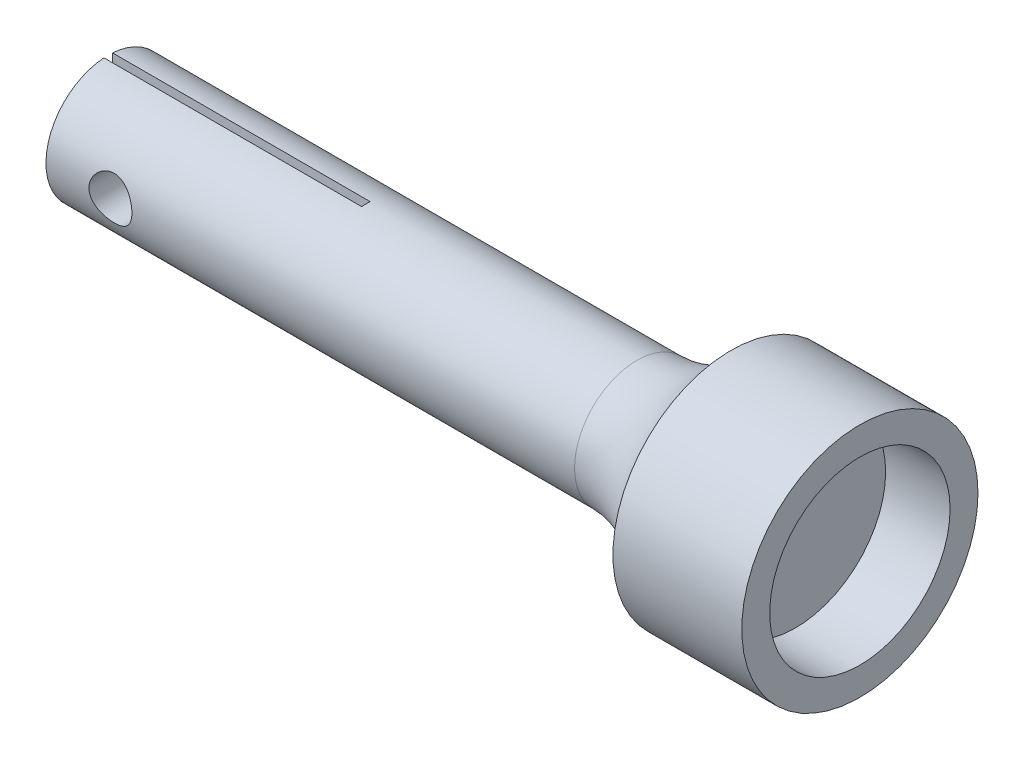
ISO-10303-21;
HEADER;
FILE_DESCRIPTION(('STEP AP214'),'2;1');
FILE_NAME('part.step','',(''),(''),'','','');
FILE_SCHEMA(('AUTOMOTIVE_DESIGN { 1 0 10303 214 1 1 1 1 }'));
ENDSEC;
DATA;
#1=APPLICATION_CONTEXT('core data for automotive mechanical design processes');
#2=APPLICATION_PROTOCOL_DEFINITION('international standard','automotive_design',2000,#1);
#3=PRODUCT_CONTEXT('',#1,'mechanical');
#4=PRODUCT('Part','Part','',(#3));
#5=PRODUCT_RELATED_PRODUCT_CATEGORY('part','',(#4));
#6=PRODUCT_DEFINITION_FORMATION('','',#4);
#7=PRODUCT_DEFINITION_CONTEXT('part definition',#1,'design');
#8=PRODUCT_DEFINITION('design','',#6,#7);
#9=PRODUCT_DEFINITION_SHAPE('','',#8);
#10=(LENGTH_UNIT() NAMED_UNIT(*) SI_UNIT(.MILLI.,.METRE.));
#11=(NAMED_UNIT(*) PLANE_ANGLE_UNIT() SI_UNIT($,.RADIAN.));
#12=(NAMED_UNIT(*) SI_UNIT($,.STERADIAN.) SOLID_ANGLE_UNIT());
#13=UNCERTAINTY_MEASURE_WITH_UNIT(LENGTH_MEASURE(1.E-05),#10,'distance_accuracy_value','');
#14=(GEOMETRIC_REPRESENTATION_CONTEXT(3) GLOBAL_UNCERTAINTY_ASSIGNED_CONTEXT((#13)) GLOBAL_UNIT_ASSIGNED_CONTEXT((#10,
#11,#12)) REPRESENTATION_CONTEXT('',''));
#15=CARTESIAN_POINT('',(0.,0.,0.));
#16=DIRECTION('',(0.,0.,1.));
#17=DIRECTION('',(1.,0.,0.));
#18=AXIS2_PLACEMENT_3D('',#15,#16,#17);
#19=CARTESIAN_POINT('',(35.,0.,0.));
#20=DIRECTION('',(-1.,0.,0.));
#21=DIRECTION('',(0.,0.,1.));
#22=AXIS2_PLACEMENT_3D('',#19,#20,#21);
#23=CYLINDRICAL_SURFACE('',#22,2.9);
#24=CARTESIAN_POINT('',(24.6136575601077,0.,0.));
#25=DIRECTION('',(1.,0.,0.));
#26=DIRECTION('',(0.,0.,-1.));
#27=AXIS2_PLACEMENT_3D('',#24,#25,#26);
#28=CIRCLE('',#27,2.9);
#29=CARTESIAN_POINT('',(24.6136575601077,0.,-2.9));
#30=VERTEX_POINT('',#29);
#31=EDGE_CURVE('E11',#30,#30,#28,.F.);
#32=ORIENTED_EDGE('',*,*,#31,.T.);
#33=EDGE_LOOP('',(#32));
#34=FACE_BOUND('',#33,.T.);
#35=CARTESIAN_POINT('',(3.99999404049821,0.,2.9));
#36=CARTESIAN_POINT('',(3.99980665343065,0.054464581520682,2.90000044547209));
#37=CARTESIAN_POINT('',(3.99515402737745,0.108909158166563,2.89845171840446));
#38=CARTESIAN_POINT('',(3.97710229156492,0.216157473174874,2.89243177943249));
#39=CARTESIAN_POINT('',(3.9637028451294,0.268961148294962,2.88796045503368));
#40=CARTESIAN_POINT('',(3.92867385100979,0.371366993483788,2.87658461533888));
#41=CARTESIAN_POINT('',(3.90705867249376,0.420974577301274,2.86968434976551));
#42=CARTESIAN_POINT('',(3.8562767609551,0.515862220429733,2.85415499250082));
#43=CARTESIAN_POINT('',(3.82710838351144,0.56114133443872,2.84552552443424));
#44=CARTESIAN_POINT('',(3.76092262611943,0.647750205160698,2.82709145927908));
#45=CARTESIAN_POINT('',(3.72367717078349,0.688899359123849,2.81725739643333));
#46=CARTESIAN_POINT('',(3.6428854967667,0.764506273208073,2.79768802354975));
#47=CARTESIAN_POINT('',(3.59933778581236,0.798962443999024,2.78795273748656));
#48=CARTESIAN_POINT('',(3.50554398533497,0.861237782008968,2.76936103341232));
#49=CARTESIAN_POINT('',(3.45513351226858,0.888821182355332,2.76054069383681));
#50=CARTESIAN_POINT('',(3.3500356479676,0.935039630398493,2.74523188932798));
#51=CARTESIAN_POINT('',(3.2953496859037,0.953677653526569,2.73874264920008));
#52=CARTESIAN_POINT('',(3.18532355782714,0.980797899806465,2.72914583302455));
#53=CARTESIAN_POINT('',(3.13007764885033,0.989621255546706,2.72592503337929));
#54=CARTESIAN_POINT('',(3.01880301099517,0.997924912373514,2.72289687865501));
#55=CARTESIAN_POINT('',(2.96277454438534,0.997408272016872,2.72308840614522));
#56=CARTESIAN_POINT('',(2.85441917057035,0.987316689406509,2.72676179672425));
#57=CARTESIAN_POINT('',(2.80204475248956,0.978183450876782,2.73008320631409));
#58=CARTESIAN_POINT('',(2.69962143511588,0.951832893957071,2.73938083645186));
#59=CARTESIAN_POINT('',(2.64957283929843,0.93461452384829,2.74535740237868));
#60=CARTESIAN_POINT('',(2.55219599498333,0.892282191854265,2.75940857278499));
#61=CARTESIAN_POINT('',(2.50493107985492,0.867034678862537,2.76751823130884));
#62=CARTESIAN_POINT('',(2.41516871979746,0.80945460858557,2.78490319254488));
#63=CARTESIAN_POINT('',(2.37267273223009,0.777119894351839,2.79417884975467));
#64=CARTESIAN_POINT('',(2.29116909991086,0.704158799925793,2.8134781728678));
#65=CARTESIAN_POINT('',(2.25248726077434,0.663171085198727,2.8235147369521));
#66=CARTESIAN_POINT('',(2.18246122272713,0.575160566726664,2.8427481160544));
#67=CARTESIAN_POINT('',(2.15111776786691,0.528137151760101,2.85194484586265));
#68=CARTESIAN_POINT('',(2.09640712786078,0.428717022858946,2.86858225182407));
#69=CARTESIAN_POINT('',(2.07312425104658,0.376270552797056,2.87600412946802));
#70=CARTESIAN_POINT('',(2.03581341715102,0.267887851730581,2.88811418602225));
#71=CARTESIAN_POINT('',(2.02178199451763,0.211952936085917,2.8928033885035));
#72=CARTESIAN_POINT('',(2.00395289725498,0.100961462789691,2.89875006472955));
#73=CARTESIAN_POINT('',(1.99971179013511,0.0459839946263828,2.9001562709705));
#74=CARTESIAN_POINT('',(2.00031855062634,-0.0639052332866241,2.89981604187808));
#75=CARTESIAN_POINT('',(2.0051648190918,-0.11881700289607,2.89807016123339));
#76=CARTESIAN_POINT('',(2.02346217628331,-0.225268981602774,2.89171457884867));
#77=CARTESIAN_POINT('',(2.03664609239861,-0.276860942125065,2.88719392029373));
#78=CARTESIAN_POINT('',(2.07090854913095,-0.377075950510623,2.87582321844246));
#79=CARTESIAN_POINT('',(2.09198813894617,-0.425698602805168,2.86897286558128));
#80=CARTESIAN_POINT('',(2.14210048983227,-0.520120040805734,2.85338931812693));
#81=CARTESIAN_POINT('',(2.1713404581055,-0.565800780840766,2.84460854341361));
#82=CARTESIAN_POINT('',(2.23669836559923,-0.651748288075913,2.82615633153855));
#83=CARTESIAN_POINT('',(2.27281854838725,-0.692013281929063,2.81648460437907));
#84=CARTESIAN_POINT('',(2.35299098168643,-0.768028568002401,2.79673919728646));
#85=CARTESIAN_POINT('',(2.39734388624321,-0.803463444220474,2.78666888404577));
#86=CARTESIAN_POINT('',(2.49158732273754,-0.866428441564636,2.7677402735469));
#87=CARTESIAN_POINT('',(2.54147794779419,-0.893958429738781,2.75888199667523));
#88=CARTESIAN_POINT('',(2.64543181696445,-0.940207758493911,2.7434660823836));
#89=CARTESIAN_POINT('',(2.69948770095462,-0.958942243405089,2.73690449545739));
#90=CARTESIAN_POINT('',(2.81026916189554,-0.986947229101579,2.72693244905969));
#91=CARTESIAN_POINT('',(2.86699339762616,-0.996222432433082,2.72352042390887));
#92=CARTESIAN_POINT('',(2.97811491365893,-1.0046779545737,2.72041177966843));
#93=CARTESIAN_POINT('',(3.03246675490548,-1.00438965020841,2.72051958296488));
#94=CARTESIAN_POINT('',(3.14030165471986,-0.995038917259361,2.72395333951936));
#95=CARTESIAN_POINT('',(3.19378476731157,-0.985977036420873,2.72727909187684));
#96=CARTESIAN_POINT('',(3.29723879287659,-0.95971526277338,2.73662809198885));
#97=CARTESIAN_POINT('',(3.34725998961496,-0.942691032115901,2.7425929700232));
#98=CARTESIAN_POINT('',(3.44377502275892,-0.901130615751718,2.75652711698348));
#99=CARTESIAN_POINT('',(3.49026803090592,-0.876592672931814,2.7644968546764));
#100=CARTESIAN_POINT('',(3.5807694389694,-0.81936057432578,2.78201053480927));
#101=CARTESIAN_POINT('',(3.62455916653442,-0.786337970636084,2.79161076236934));
#102=CARTESIAN_POINT('',(3.70614544398798,-0.713625822124459,2.81107686227833));
#103=CARTESIAN_POINT('',(3.74394023447129,-0.673934327115972,2.82094281162167));
#104=CARTESIAN_POINT('',(3.81409384195148,-0.58697807802039,2.84033823368347));
#105=CARTESIAN_POINT('',(3.84615168018305,-0.539462338137375,2.84983535691801));
#106=CARTESIAN_POINT('',(3.9017928586473,-0.439394021766622,2.86696796562436));
#107=CARTESIAN_POINT('',(3.92537770645062,-0.386842343416355,2.8746037821944));
#108=CARTESIAN_POINT('',(3.96282035416129,-0.279387678342414,2.8870052949059));
#109=CARTESIAN_POINT('',(3.97688430549397,-0.224563783257893,2.89183147940451));
#110=CARTESIAN_POINT('',(3.99556692245,-0.113152346944582,2.89832808821211));
#111=CARTESIAN_POINT('',(4.00018865544312,-0.0565653845270848,2.8999995373452));
#112=CARTESIAN_POINT('',(3.99999404049821,0.,2.9));
#113=B_SPLINE_CURVE_WITH_KNOTS('',3,(#35,#36,#37,#38,#39,#40,#41,#42,#43,#44,#45,#46,#47,#48,
#49,#50,#51,#52,#53,#54,#55,#56,#57,#58,#59,#60,#61,#62,#63,#64,#65,#66,#67,#68,#69,#70,#71,#72,
#73,#74,#75,#76,#77,#78,#79,#80,#81,#82,#83,#84,#85,#86,#87,#88,#89,#90,#91,#92,#93,#94,#95,#96,
#97,#98,#99,#100,#101,#102,#103,#104,#105,#106,#107,#108,#109,#110,#111,#112),.UNSPECIFIED.,.T.,
.F.,(4,2,2,2,2,2,2,2,2,2,2,2,2,2,2,2,2,2,2,2,2,2,2,2,2,2,2,2,2,2,2,2,2,2,2,2,2,2,4),(0.,
0.163186329623232,0.326378940865444,0.489287434816881,0.652231425742869,0.820575212375441,
0.988958925545892,1.16250309549465,1.33598950072153,1.50323671978019,1.67042917159445,
1.82949148194305,1.98857448894733,2.15045566021257,2.31238616765092,2.48332953743942,
2.65429023195019,2.82698856165705,2.99962216255688,3.16426883704888,3.32888654065694,
3.48847938434288,3.64809344267939,3.812201329649,3.97636282241749,4.14852002962218,
4.32068013216137,4.49254270776625,4.66431980264653,4.82656931927434,4.98880870711639,
5.14762644984913,5.30648136118026,5.47278373043322,5.63913481646781,5.81258816901448,
5.98601064428797,6.15554646618413,6.32502720443595),.UNSPECIFIED.);
#114=CARTESIAN_POINT('',(3.99999404049821,0.,2.9));
#115=VERTEX_POINT('',#114);
#116=EDGE_CURVE('E98',#115,#115,#113,.T.);
#117=ORIENTED_EDGE('',*,*,#116,.F.);
#118=EDGE_LOOP('',(#117));
#119=FACE_BOUND('',#118,.T.);
#120=CARTESIAN_POINT('',(3.,-1.00345238585106,-2.72086076625207));
#121=CARTESIAN_POINT('',(2.94566893235899,-1.00345305999284,-2.72086021317153));
#122=CARTESIAN_POINT('',(2.89134253045788,-0.999009639562248,-2.72251153528407));
#123=CARTESIAN_POINT('',(2.7843073470255,-0.981419137113374,-2.72890129793882));
#124=CARTESIAN_POINT('',(2.7315987427294,-0.968271105011566,-2.73364007546708));
#125=CARTESIAN_POINT('',(2.62936917680646,-0.933795402899488,-2.74560649818595));
#126=CARTESIAN_POINT('',(2.57984181812114,-0.912484788995944,-2.75282895042417));
#127=CARTESIAN_POINT('',(2.48504853913221,-0.862348136474104,-2.76894323666809));
#128=CARTESIAN_POINT('',(2.43978366537773,-0.833520258689754,-2.77783547905372));
#129=CARTESIAN_POINT('',(2.35289105098564,-0.767865567456131,-2.79671067974953));
#130=CARTESIAN_POINT('',(2.31146906378093,-0.730774639190829,-2.80672237157249));
#131=CARTESIAN_POINT('',(2.23529155720145,-0.650209936416532,-2.82647224615793));
#132=CARTESIAN_POINT('',(2.20053721085951,-0.606735041151961,-2.83621038053691));
#133=CARTESIAN_POINT('',(2.1377241490165,-0.513105991243302,-2.8546557797525));
#134=CARTESIAN_POINT('',(2.10988488496225,-0.462796598211759,-2.86332568248111));
#135=CARTESIAN_POINT('',(2.06314738996144,-0.357858093927532,-2.87832267666306));
#136=CARTESIAN_POINT('',(2.04424657693797,-0.303230235491405,-2.8846504445809));
#137=CARTESIAN_POINT('',(2.01662338042609,-0.193347112050209,-2.8940531545862));
#138=CARTESIAN_POINT('',(2.00755063122176,-0.138189654742778,-2.8972396740321));
#139=CARTESIAN_POINT('',(1.9987266279835,-0.027049048629246,-2.9004060699528));
#140=CARTESIAN_POINT('',(1.99897278546178,0.0289338665728237,-2.90038683687585));
#141=CARTESIAN_POINT('',(2.00856252393479,0.137625582023931,-2.89722155986127));
#142=CARTESIAN_POINT('',(2.01752155515124,0.190372821437223,-2.89420757026013));
#143=CARTESIAN_POINT('',(2.04364549230479,0.293565337173213,-2.88556784571808));
#144=CARTESIAN_POINT('',(2.0608109506516,0.344010458280031,-2.87994193495832));
#145=CARTESIAN_POINT('',(2.10306380374873,0.441955880220833,-2.86655764298503));
#146=CARTESIAN_POINT('',(2.12825303409353,0.489408372673726,-2.85877202516899));
#147=CARTESIAN_POINT('',(2.18575280861581,0.579523136222244,-2.84187578287272));
#148=CARTESIAN_POINT('',(2.21806541694259,0.622184013426224,-2.83276477459341));
#149=CARTESIAN_POINT('',(2.29078922512315,0.703762509714338,-2.81363851749344));
#150=CARTESIAN_POINT('',(2.33152455198626,0.742386348329868,-2.80360083413691));
#151=CARTESIAN_POINT('',(2.41897100792909,0.812355016067043,-2.7841338849641));
#152=CARTESIAN_POINT('',(2.46568319678563,0.843698551512895,-2.77470472749465));
#153=CARTESIAN_POINT('',(2.56475924012264,0.898670505204048,-2.75739707918534));
#154=CARTESIAN_POINT('',(2.61720312886419,0.922164154932908,-2.74954651501986));
#155=CARTESIAN_POINT('',(2.7256409113218,0.959884764577871,-2.73660804649032));
#156=CARTESIAN_POINT('',(2.7816331940916,0.974115897005448,-2.73151889835572));
#157=CARTESIAN_POINT('',(2.89273293123637,0.992293807321214,-2.72496651191048));
#158=CARTESIAN_POINT('',(2.94775629835506,0.996696547696071,-2.72334267843518));
#159=CARTESIAN_POINT('',(3.05776798390255,0.996391051294897,-2.72345471292078));
#160=CARTESIAN_POINT('',(3.11275630710812,0.991684614395713,-2.72518991717145));
#161=CARTESIAN_POINT('',(3.21898694835471,0.973706350635806,-2.73166254207127));
#162=CARTESIAN_POINT('',(3.27029243382318,0.96076187939061,-2.7362851027711));
#163=CARTESIAN_POINT('',(3.36998994992106,0.927073032755894,-2.7478811371546));
#164=CARTESIAN_POINT('',(3.41838144157433,0.906327219529437,-2.75485504418184));
#165=CARTESIAN_POINT('',(3.51265601203353,0.856844928483975,-2.77065167629178));
#166=CARTESIAN_POINT('',(3.55840284270796,0.827866455685994,-2.77952800547223));
#167=CARTESIAN_POINT('',(3.64454956081268,0.763010208204302,-2.79802624699304));
#168=CARTESIAN_POINT('',(3.68494776955967,0.72713027609943,-2.80764839191506));
#169=CARTESIAN_POINT('',(3.76140907639617,0.647290220975024,-2.82715171540382));
#170=CARTESIAN_POINT('',(3.79714049956896,0.603008476243458,-2.83702060425689));
#171=CARTESIAN_POINT('',(3.86069151344774,0.508832932689615,-2.85541373280247));
#172=CARTESIAN_POINT('',(3.88851133959538,0.458939300933451,-2.86393801250591));
#173=CARTESIAN_POINT('',(3.93520220991634,0.355172999359479,-2.87864166119301));
#174=CARTESIAN_POINT('',(3.95412807232818,0.301327134155515,-2.88483534639934));
#175=CARTESIAN_POINT('',(3.98257201178281,0.190960227968752,-2.89423492121065));
#176=CARTESIAN_POINT('',(3.99209373995218,0.134440234146481,-2.89744197034039));
#177=CARTESIAN_POINT('',(4.00111424155103,0.0233667148665714,-2.90041149574827));
#178=CARTESIAN_POINT('',(4.0010896475362,-0.0311441224823622,-2.90033793823468));
#179=CARTESIAN_POINT('',(3.99220909351165,-0.139345884020662,-2.89715575799774));
#180=CARTESIAN_POINT('',(3.98335391973378,-0.193036880772544,-2.89404740547828));
#181=CARTESIAN_POINT('',(3.95738342041427,-0.297127069654995,-2.88520341500109));
#182=CARTESIAN_POINT('',(3.94041665326756,-0.347567637508001,-2.87951511954888));
#183=CARTESIAN_POINT('',(3.8988467648995,-0.444900676590368,-2.86609137345669));
#184=CARTESIAN_POINT('',(3.87424222445277,-0.491792486385586,-2.8583555423899));
#185=CARTESIAN_POINT('',(3.81700012147922,-0.582681258921847,-2.84125053015508));
#186=CARTESIAN_POINT('',(3.78408808327106,-0.626495484694052,-2.83182964865602));
#187=CARTESIAN_POINT('',(3.71162253659431,-0.708132805944205,-2.81252747399333));
#188=CARTESIAN_POINT('',(3.67206682613533,-0.745953906946411,-2.80264602896683));
#189=CARTESIAN_POINT('',(3.585417997114,-0.816179871818548,-2.78302676539399));
#190=CARTESIAN_POINT('',(3.53807504193548,-0.848284273074711,-2.77331312276287));
#191=CARTESIAN_POINT('',(3.43835784877927,-0.904065659755595,-2.75563521416128));
#192=CARTESIAN_POINT('',(3.38598449552958,-0.927744123669301,-2.74767064137764));
#193=CARTESIAN_POINT('',(3.27884601645684,-0.965427356382383,-2.7346556717468));
#194=CARTESIAN_POINT('',(3.22416066899574,-0.979636796504084,-2.72954403479919));
#195=CARTESIAN_POINT('',(3.11298135708933,-0.998646999275909,-2.72264756313134));
#196=CARTESIAN_POINT('',(3.05648815675502,-1.00345168494404,-2.72086134129139));
#197=CARTESIAN_POINT('',(3.,-1.00345238585106,-2.72086076625207));
#198=B_SPLINE_CURVE_WITH_KNOTS('',3,(#120,#121,#122,#123,#124,#125,#126,#127,#128,#129,#130,
#131,#132,#133,#134,#135,#136,#137,#138,#139,#140,#141,#142,#143,#144,#145,#146,#147,#148,#149,
#150,#151,#152,#153,#154,#155,#156,#157,#158,#159,#160,#161,#162,#163,#164,#165,#166,#167,#168,
#169,#170,#171,#172,#173,#174,#175,#176,#177,#178,#179,#180,#181,#182,#183,#184,#185,#186,#187,
#188,#189,#190,#191,#192,#193,#194,#195,#196,#197),.UNSPECIFIED.,.T.,.F.,(4,2,2,2,2,2,2,2,2,2,2,
2,2,2,2,2,2,2,2,2,2,2,2,2,2,2,2,2,2,2,2,2,2,2,2,2,2,2,4),(0.,0.162783640432791,
0.325585051165192,0.48804812013714,0.650550974510754,0.819278892298359,0.98803646709062,
1.1616113480098,1.33513605716309,1.50224748559135,1.66931249626558,1.82932369651846,
1.98934566932663,2.15148543774814,2.31367225149579,2.48396770465968,2.65429339541776,
2.82740873434802,3.00044603546556,3.16527249789327,3.33006639568443,3.48868911362301,
3.64734108107733,3.81125002275815,3.97521028648539,4.14763900612138,4.32006259390509,
4.49140903416606,4.66268892350996,4.82541824017965,4.98813306951628,5.14797582779595,
5.30784830531738,5.47391952994901,5.64004590653313,5.81327030678004,5.9864642965465,
6.15578152671844,6.3250281143003),.UNSPECIFIED.);
#199=CARTESIAN_POINT('',(3.,-1.00345238585106,-2.72086076625207));
#200=VERTEX_POINT('',#199);
#201=EDGE_CURVE('E117',#200,#200,#198,.T.);
#202=ORIENTED_EDGE('',*,*,#201,.F.);
#203=EDGE_LOOP('',(#202));
#204=FACE_BOUND('',#203,.T.);
#205=CARTESIAN_POINT('',(0.,0.,0.));
#206=DIRECTION('',(1.,0.,0.));
#207=DIRECTION('',(0.,0.,-1.));
#208=AXIS2_PLACEMENT_3D('',#205,#206,#207);
#209=CIRCLE('',#208,2.9);
#210=CARTESIAN_POINT('',(0.,2.89309522829789,0.2));
#211=VERTEX_POINT('',#210);
#212=CARTESIAN_POINT('',(0.,2.89309522829789,-0.2));
#213=VERTEX_POINT('',#212);
#214=EDGE_CURVE('E106',#211,#213,#209,.T.);
#215=ORIENTED_EDGE('',*,*,#214,.T.);
#216=DIRECTION('',(-1.,0.,0.));
#217=VECTOR('',#216,1.);
#218=CARTESIAN_POINT('',(35.,2.89309522829789,-0.2));
#219=LINE('',#218,#217);
#220=CARTESIAN_POINT('',(12.,2.89309522829789,-0.2));
#221=VERTEX_POINT('',#220);
#222=EDGE_CURVE('E104',#213,#221,#219,.F.);
#223=ORIENTED_EDGE('',*,*,#222,.T.);
#224=CARTESIAN_POINT('',(12.,0.,0.));
#225=DIRECTION('',(-1.,0.,0.));
#226=DIRECTION('',(0.,0.,1.));
#227=AXIS2_PLACEMENT_3D('',#224,#225,#226);
#228=CIRCLE('',#227,2.9);
#229=CARTESIAN_POINT('',(12.,2.89309522829789,0.2));
#230=VERTEX_POINT('',#229);
#231=EDGE_CURVE('E43',#230,#221,#228,.T.);
#232=ORIENTED_EDGE('',*,*,#231,.F.);
#233=DIRECTION('',(-1.,0.,0.));
#234=VECTOR('',#233,1.);
#235=CARTESIAN_POINT('',(35.,2.89309522829789,0.2));
#236=LINE('',#235,#234);
#237=EDGE_CURVE('E100',#230,#211,#236,.T.);
#238=ORIENTED_EDGE('',*,*,#237,.T.);
#239=EDGE_LOOP('',(#215,#223,#232,#238));
#240=FACE_BOUND('',#239,.T.);
#241=ADVANCED_FACE('F35',(#34,#119,#204,#240),#23,.T.);
#242=CARTESIAN_POINT('',(0.,0.,0.));
#243=DIRECTION('',(1.,0.,0.));
#244=DIRECTION('',(0.,0.,-1.));
#245=AXIS2_PLACEMENT_3D('',#242,#243,#244);
#246=PLANE('',#245);
#247=DIRECTION('',(0.,0.,1.));
#248=VECTOR('',#247,1.);
#249=CARTESIAN_POINT('',(0.,-2.32901081224555,-0.199999999999999));
#250=LINE('',#249,#248);
#251=CARTESIAN_POINT('',(0.,-2.32901081224555,-0.199999999999999));
#252=VERTEX_POINT('',#251);
#253=CARTESIAN_POINT('',(0.,-2.32901081224555,0.200000000000001));
#254=VERTEX_POINT('',#253);
#255=EDGE_CURVE('E96',#252,#254,#250,.T.);
#256=ORIENTED_EDGE('',*,*,#255,.F.);
#257=DIRECTION('',(0.,1.,0.));
#258=VECTOR('',#257,1.);
#259=CARTESIAN_POINT('',(0.,0.,-0.2));
#260=LINE('',#259,#258);
#261=EDGE_CURVE('E85',#252,#213,#260,.T.);
#262=ORIENTED_EDGE('',*,*,#261,.T.);
#263=ORIENTED_EDGE('',*,*,#214,.F.);
#264=DIRECTION('',(0.,1.,0.));
#265=VECTOR('',#264,1.);
#266=CARTESIAN_POINT('',(0.,3.12152143585721,0.2));
#267=LINE('',#266,#265);
#268=EDGE_CURVE('E81',#254,#211,#267,.T.);
#269=ORIENTED_EDGE('',*,*,#268,.F.);
#270=EDGE_LOOP('',(#256,#262,#263,#269));
#271=FACE_BOUND('',#270,.T.);
#272=ADVANCED_FACE('F152',(#271),#246,.F.);
#273=CARTESIAN_POINT('',(12.,0.,0.));
#274=DIRECTION('',(-1.,0.,0.));
#275=DIRECTION('',(0.,0.,1.));
#276=AXIS2_PLACEMENT_3D('',#273,#274,#275);
#277=PLANE('',#276);
#278=ORIENTED_EDGE('',*,*,#231,.T.);
#279=DIRECTION('',(0.,-1.,0.));
#280=VECTOR('',#279,1.);
#281=CARTESIAN_POINT('',(12.,3.12152143585721,-0.2));
#282=LINE('',#281,#280);
#283=CARTESIAN_POINT('',(12.,-2.32901081224555,-0.199999999999999));
#284=VERTEX_POINT('',#283);
#285=EDGE_CURVE('E76',#221,#284,#282,.T.);
#286=ORIENTED_EDGE('',*,*,#285,.T.);
#287=DIRECTION('',(0.,0.,1.));
#288=VECTOR('',#287,1.);
#289=CARTESIAN_POINT('',(12.,-2.32901081224555,-0.199999999999999));
#290=LINE('',#289,#288);
#291=CARTESIAN_POINT('',(12.,-2.32901081224555,0.200000000000001));
#292=VERTEX_POINT('',#291);
#293=EDGE_CURVE('E78',#284,#292,#290,.T.);
#294=ORIENTED_EDGE('',*,*,#293,.T.);
#295=DIRECTION('',(0.,1.,0.));
#296=VECTOR('',#295,1.);
#297=CARTESIAN_POINT('',(12.,3.12152143585721,0.2));
#298=LINE('',#297,#296);
#299=EDGE_CURVE('E88',#292,#230,#298,.T.);
#300=ORIENTED_EDGE('',*,*,#299,.T.);
#301=EDGE_LOOP('',(#278,#286,#294,#300));
#302=FACE_BOUND('',#301,.T.);
#303=ADVANCED_FACE('F77',(#302),#277,.T.);
#304=CARTESIAN_POINT('',(12.,3.12152143585721,-0.2));
#305=DIRECTION('',(0.,0.,-1.));
#306=DIRECTION('',(0.,1.,0.));
#307=AXIS2_PLACEMENT_3D('',#304,#305,#306);
#308=PLANE('',#307);
#309=CARTESIAN_POINT('',(3.,-0.00345238585105743,-0.200000000000001));
#310=DIRECTION('',(0.,0.,-1.));
#311=DIRECTION('',(0.,1.,0.));
#312=AXIS2_PLACEMENT_3D('',#309,#310,#311);
#313=CIRCLE('',#312,1.);
#314=CARTESIAN_POINT('',(3.,0.996547614148943,-0.200000000000001));
#315=VERTEX_POINT('',#314);
#316=EDGE_CURVE('E112',#315,#315,#313,.F.);
#317=ORIENTED_EDGE('',*,*,#316,.F.);
#318=EDGE_LOOP('',(#317));
#319=FACE_BOUND('',#318,.T.);
#320=ORIENTED_EDGE('',*,*,#261,.F.);
#321=DIRECTION('',(-1.,0.,0.));
#322=VECTOR('',#321,1.);
#323=CARTESIAN_POINT('',(12.,-2.32901081224555,-0.199999999999999));
#324=LINE('',#323,#322);
#325=EDGE_CURVE('E50',#284,#252,#324,.T.);
#326=ORIENTED_EDGE('',*,*,#325,.F.);
#327=ORIENTED_EDGE('',*,*,#285,.F.);
#328=ORIENTED_EDGE('',*,*,#222,.F.);
#329=EDGE_LOOP('',(#320,#326,#327,#328));
#330=FACE_BOUND('',#329,.T.);
#331=ADVANCED_FACE('F83',(#319,#330),#308,.F.);
#332=CARTESIAN_POINT('',(12.,3.12152143585721,0.2));
#333=DIRECTION('',(0.,0.,1.));
#334=DIRECTION('',(0.,-1.,0.));
#335=AXIS2_PLACEMENT_3D('',#332,#333,#334);
#336=PLANE('',#335);
#337=CARTESIAN_POINT('',(3.,-0.00345238585105739,0.200000000000001));
#338=DIRECTION('',(0.,0.,1.));
#339=DIRECTION('',(0.,-1.,0.));
#340=AXIS2_PLACEMENT_3D('',#337,#338,#339);
#341=CIRCLE('',#340,1.);
#342=CARTESIAN_POINT('',(3.,-1.00345238585106,0.200000000000001));
#343=VERTEX_POINT('',#342);
#344=EDGE_CURVE('E110',#343,#343,#341,.F.);
#345=ORIENTED_EDGE('',*,*,#344,.F.);
#346=EDGE_LOOP('',(#345));
#347=FACE_BOUND('',#346,.T.);
#348=ORIENTED_EDGE('',*,*,#299,.F.);
#349=DIRECTION('',(-1.,0.,0.));
#350=VECTOR('',#349,1.);
#351=CARTESIAN_POINT('',(12.,-2.32901081224555,0.200000000000001));
#352=LINE('',#351,#350);
#353=EDGE_CURVE('E87',#292,#254,#352,.T.);
#354=ORIENTED_EDGE('',*,*,#353,.T.);
#355=ORIENTED_EDGE('',*,*,#268,.T.);
#356=ORIENTED_EDGE('',*,*,#237,.F.);
#357=EDGE_LOOP('',(#348,#354,#355,#356));
#358=FACE_BOUND('',#357,.T.);
#359=ADVANCED_FACE('F153',(#347,#358),#336,.F.);
#360=CARTESIAN_POINT('',(12.,-2.32901081224555,-0.199999999999999));
#361=DIRECTION('',(0.,-1.,0.));
#362=DIRECTION('',(0.,0.,-1.));
#363=AXIS2_PLACEMENT_3D('',#360,#361,#362);
#364=PLANE('',#363);
#365=ORIENTED_EDGE('',*,*,#255,.T.);
#366=ORIENTED_EDGE('',*,*,#353,.F.);
#367=ORIENTED_EDGE('',*,*,#293,.F.);
#368=ORIENTED_EDGE('',*,*,#325,.T.);
#369=EDGE_LOOP('',(#365,#366,#367,#368));
#370=FACE_BOUND('',#369,.T.);
#371=ADVANCED_FACE('F90',(#370),#364,.F.);
#372=CARTESIAN_POINT('',(3.,-0.00345238585105858,-9.8));
#373=DIRECTION('',(0.,0.,1.));
#374=DIRECTION('',(0.,-1.,0.));
#375=AXIS2_PLACEMENT_3D('',#372,#373,#374);
#376=CYLINDRICAL_SURFACE('',#375,1.);
#377=ORIENTED_EDGE('',*,*,#344,.T.);
#378=EDGE_LOOP('',(#377));
#379=FACE_BOUND('',#378,.T.);
#380=ORIENTED_EDGE('',*,*,#116,.T.);
#381=EDGE_LOOP('',(#380));
#382=FACE_BOUND('',#381,.T.);
#383=ADVANCED_FACE('F141',(#379,#382),#376,.F.);
#384=ORIENTED_EDGE('',*,*,#316,.T.);
#385=EDGE_LOOP('',(#384));
#386=FACE_BOUND('',#385,.T.);
#387=ORIENTED_EDGE('',*,*,#201,.T.);
#388=EDGE_LOOP('',(#387));
#389=FACE_BOUND('',#388,.T.);
#390=ADVANCED_FACE('F146',(#386,#389),#376,.F.);
#391=CARTESIAN_POINT('',(29.,0.,0.));
#392=DIRECTION('',(1.,0.,0.));
#393=DIRECTION('',(0.,0.,-1.));
#394=AXIS2_PLACEMENT_3D('',#391,#392,#393);
#395=CYLINDRICAL_SURFACE('',#394,5.5);
#396=CARTESIAN_POINT('',(29.,0.,0.));
#397=DIRECTION('',(1.,0.,0.));
#398=DIRECTION('',(0.,0.,-1.));
#399=AXIS2_PLACEMENT_3D('',#396,#397,#398);
#400=CIRCLE('',#399,5.5);
#401=CARTESIAN_POINT('',(29.,0.,-5.5));
#402=VERTEX_POINT('',#401);
#403=EDGE_CURVE('E113',#402,#402,#400,.T.);
#404=ORIENTED_EDGE('',*,*,#403,.T.);
#405=EDGE_LOOP('',(#404));
#406=FACE_BOUND('',#405,.T.);
#407=CARTESIAN_POINT('',(35.,0.,0.));
#408=DIRECTION('',(1.,0.,0.));
#409=DIRECTION('',(0.,0.,-1.));
#410=AXIS2_PLACEMENT_3D('',#407,#408,#409);
#411=CIRCLE('',#410,5.5);
#412=CARTESIAN_POINT('',(35.,0.,-5.5));
#413=VERTEX_POINT('',#412);
#414=EDGE_CURVE('E120',#413,#413,#411,.T.);
#415=ORIENTED_EDGE('',*,*,#414,.F.);
#416=EDGE_LOOP('',(#415));
#417=FACE_BOUND('',#416,.T.);
#418=ADVANCED_FACE('F147',(#406,#417),#395,.T.);
#419=CARTESIAN_POINT('',(35.,0.,0.));
#420=DIRECTION('',(1.,0.,0.));
#421=DIRECTION('',(0.,0.,-1.));
#422=AXIS2_PLACEMENT_3D('',#419,#420,#421);
#423=PLANE('',#422);
#424=CARTESIAN_POINT('',(35.,0.,0.));
#425=DIRECTION('',(1.,0.,0.));
#426=DIRECTION('',(0.,0.,-1.));
#427=AXIS2_PLACEMENT_3D('',#424,#425,#426);
#428=CIRCLE('',#427,4.2);
#429=CARTESIAN_POINT('',(35.,0.,-4.2));
#430=VERTEX_POINT('',#429);
#431=EDGE_CURVE('E128',#430,#430,#428,.T.);
#432=ORIENTED_EDGE('',*,*,#431,.F.);
#433=EDGE_LOOP('',(#432));
#434=FACE_BOUND('',#433,.T.);
#435=ORIENTED_EDGE('',*,*,#414,.T.);
#436=EDGE_LOOP('',(#435));
#437=FACE_BOUND('',#436,.T.);
#438=ADVANCED_FACE('F162',(#434,#437),#423,.T.);
#439=CARTESIAN_POINT('',(32.,0.,0.));
#440=DIRECTION('',(1.,0.,0.));
#441=DIRECTION('',(0.,0.,-1.));
#442=AXIS2_PLACEMENT_3D('',#439,#440,#441);
#443=CYLINDRICAL_SURFACE('',#442,4.2);
#444=CARTESIAN_POINT('',(32.,0.,0.));
#445=DIRECTION('',(1.,0.,0.));
#446=DIRECTION('',(0.,0.,-1.));
#447=AXIS2_PLACEMENT_3D('',#444,#445,#446);
#448=CIRCLE('',#447,4.2);
#449=CARTESIAN_POINT('',(32.,0.,-4.2));
#450=VERTEX_POINT('',#449);
#451=EDGE_CURVE('E125',#450,#450,#448,.T.);
#452=ORIENTED_EDGE('',*,*,#451,.F.);
#453=EDGE_LOOP('',(#452));
#454=FACE_BOUND('',#453,.T.);
#455=ORIENTED_EDGE('',*,*,#431,.T.);
#456=EDGE_LOOP('',(#455));
#457=FACE_BOUND('',#456,.T.);
#458=ADVANCED_FACE('F164',(#454,#457),#443,.F.);
#459=CARTESIAN_POINT('',(32.,0.,0.));
#460=DIRECTION('',(1.,0.,0.));
#461=DIRECTION('',(0.,0.,-1.));
#462=AXIS2_PLACEMENT_3D('',#459,#460,#461);
#463=PLANE('',#462);
#464=ORIENTED_EDGE('',*,*,#451,.T.);
#465=EDGE_LOOP('',(#464));
#466=FACE_BOUND('',#465,.T.);
#467=ADVANCED_FACE('F206',(#466),#463,.T.);
#468=CARTESIAN_POINT('',(24.6136575601077,0.,0.));
#469=DIRECTION('',(1.,0.,0.));
#470=DIRECTION('',(0.,0.,-1.));
#471=AXIS2_PLACEMENT_3D('',#468,#469,#470);
#472=TOROIDAL_SURFACE('',#471,7.9,5.);
#473=ORIENTED_EDGE('',*,*,#31,.F.);
#474=EDGE_LOOP('',(#473));
#475=FACE_BOUND('',#474,.T.);
#476=ORIENTED_EDGE('',*,*,#403,.F.);
#477=EDGE_LOOP('',(#476));
#478=FACE_BOUND('',#477,.T.);
#479=ADVANCED_FACE('F37',(#475,#478),#472,.F.);
#480=CLOSED_SHELL('',(#241,#272,#303,#331,#359,#371,#383,#390,#418,#438,#458,#467,#479));
#481=MANIFOLD_SOLID_BREP('B2',#480);
#482=ADVANCED_BREP_SHAPE_REPRESENTATION('',(#18,#481),#14);
#483=SHAPE_DEFINITION_REPRESENTATION(#9,#482);
ENDSEC;
END-ISO-10303-21;
